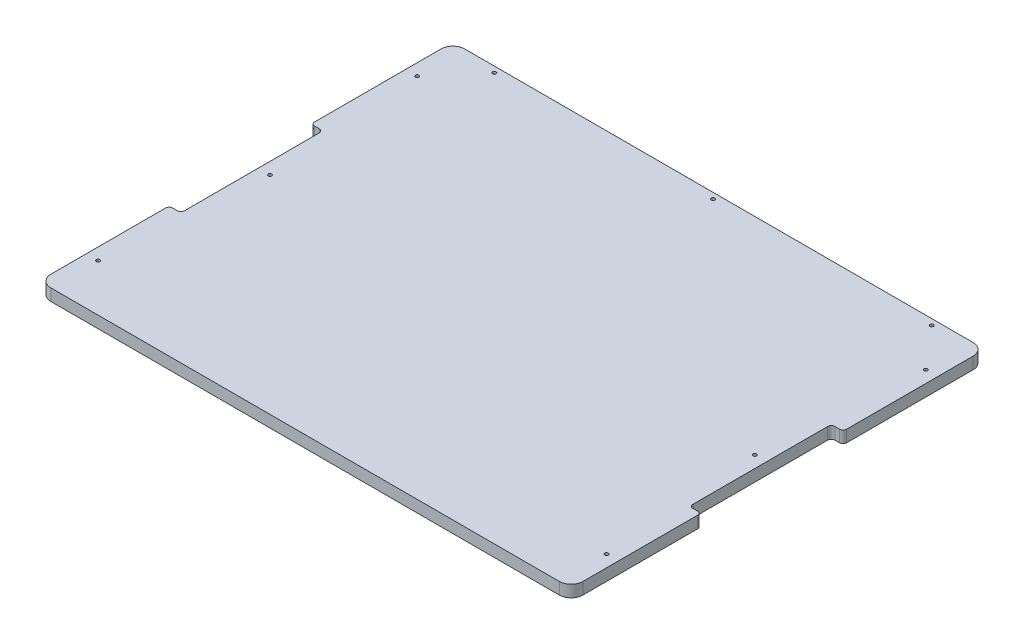
ISO-10303-21;
HEADER;
FILE_DESCRIPTION(('STEP AP214'),'2;1');
FILE_NAME('part.step','',(''),(''),'','','');
FILE_SCHEMA(('AUTOMOTIVE_DESIGN { 1 0 10303 214 1 1 1 1 }'));
ENDSEC;
DATA;
#1=APPLICATION_CONTEXT('core data for automotive mechanical design processes');
#2=APPLICATION_PROTOCOL_DEFINITION('international standard','automotive_design',2000,#1);
#3=PRODUCT_CONTEXT('',#1,'mechanical');
#4=PRODUCT('Part','Part','',(#3));
#5=PRODUCT_RELATED_PRODUCT_CATEGORY('part','',(#4));
#6=PRODUCT_DEFINITION_FORMATION('','',#4);
#7=PRODUCT_DEFINITION_CONTEXT('part definition',#1,'design');
#8=PRODUCT_DEFINITION('design','',#6,#7);
#9=PRODUCT_DEFINITION_SHAPE('','',#8);
#10=(LENGTH_UNIT() NAMED_UNIT(*) SI_UNIT(.MILLI.,.METRE.));
#11=(NAMED_UNIT(*) PLANE_ANGLE_UNIT() SI_UNIT($,.RADIAN.));
#12=(NAMED_UNIT(*) SI_UNIT($,.STERADIAN.) SOLID_ANGLE_UNIT());
#13=UNCERTAINTY_MEASURE_WITH_UNIT(LENGTH_MEASURE(1.E-05),#10,'distance_accuracy_value','');
#14=(GEOMETRIC_REPRESENTATION_CONTEXT(3) GLOBAL_UNCERTAINTY_ASSIGNED_CONTEXT((#13)) GLOBAL_UNIT_ASSIGNED_CONTEXT((#10,
#11,#12)) REPRESENTATION_CONTEXT('',''));
#15=CARTESIAN_POINT('',(0.,0.,0.));
#16=DIRECTION('',(0.,0.,1.));
#17=DIRECTION('',(1.,0.,0.));
#18=AXIS2_PLACEMENT_3D('',#15,#16,#17);
#19=CARTESIAN_POINT('',(-225.,10.,175.));
#20=DIRECTION('',(1.,0.,0.));
#21=DIRECTION('',(0.,0.,-1.));
#22=AXIS2_PLACEMENT_3D('',#19,#20,#21);
#23=PLANE('',#22);
#24=DIRECTION('',(0.,0.,1.));
#25=VECTOR('',#24,1.);
#26=CARTESIAN_POINT('',(-225.,10.,175.));
#27=LINE('',#26,#25);
#28=CARTESIAN_POINT('',(-225.,10.,-165.));
#29=VERTEX_POINT('',#28);
#30=CARTESIAN_POINT('',(-225.,10.,-58.));
#31=VERTEX_POINT('',#30);
#32=EDGE_CURVE('E248',#29,#31,#27,.T.);
#33=ORIENTED_EDGE('',*,*,#32,.F.);
#34=DIRECTION('',(0.,-1.,0.));
#35=VECTOR('',#34,1.);
#36=CARTESIAN_POINT('',(-225.,10.,-165.));
#37=LINE('',#36,#35);
#38=CARTESIAN_POINT('',(-225.,0.,-165.));
#39=VERTEX_POINT('',#38);
#40=EDGE_CURVE('E336',#29,#39,#37,.T.);
#41=ORIENTED_EDGE('',*,*,#40,.T.);
#42=DIRECTION('',(0.,0.,1.));
#43=VECTOR('',#42,1.);
#44=CARTESIAN_POINT('',(-225.,0.,175.));
#45=LINE('',#44,#43);
#46=CARTESIAN_POINT('',(-225.,0.,-58.));
#47=VERTEX_POINT('',#46);
#48=EDGE_CURVE('E257',#39,#47,#45,.T.);
#49=ORIENTED_EDGE('',*,*,#48,.T.);
#50=DIRECTION('',(0.,1.,0.));
#51=VECTOR('',#50,1.);
#52=CARTESIAN_POINT('',(-225.,10.,-58.));
#53=LINE('',#52,#51);
#54=EDGE_CURVE('E331',#47,#31,#53,.T.);
#55=ORIENTED_EDGE('',*,*,#54,.T.);
#56=EDGE_LOOP('',(#33,#41,#49,#55));
#57=FACE_BOUND('',#56,.T.);
#58=ADVANCED_FACE('F33',(#57),#23,.F.);
#59=CARTESIAN_POINT('',(225.,10.,175.));
#60=DIRECTION('',(-1.,0.,0.));
#61=DIRECTION('',(0.,0.,1.));
#62=AXIS2_PLACEMENT_3D('',#59,#60,#61);
#63=PLANE('',#62);
#64=DIRECTION('',(0.,0.,-1.));
#65=VECTOR('',#64,1.);
#66=CARTESIAN_POINT('',(225.,10.,175.));
#67=LINE('',#66,#65);
#68=CARTESIAN_POINT('',(225.,10.,165.));
#69=VERTEX_POINT('',#68);
#70=CARTESIAN_POINT('',(225.,10.,68.));
#71=VERTEX_POINT('',#70);
#72=EDGE_CURVE('E254',#69,#71,#67,.T.);
#73=ORIENTED_EDGE('',*,*,#72,.F.);
#74=DIRECTION('',(0.,-1.,0.));
#75=VECTOR('',#74,1.);
#76=CARTESIAN_POINT('',(225.,10.,165.));
#77=LINE('',#76,#75);
#78=CARTESIAN_POINT('',(225.,0.,165.));
#79=VERTEX_POINT('',#78);
#80=EDGE_CURVE('E41',#69,#79,#77,.T.);
#81=ORIENTED_EDGE('',*,*,#80,.T.);
#82=DIRECTION('',(0.,0.,-1.));
#83=VECTOR('',#82,1.);
#84=CARTESIAN_POINT('',(225.,0.,175.));
#85=LINE('',#84,#83);
#86=CARTESIAN_POINT('',(225.,0.,68.));
#87=VERTEX_POINT('',#86);
#88=EDGE_CURVE('E263',#79,#87,#85,.T.);
#89=ORIENTED_EDGE('',*,*,#88,.T.);
#90=DIRECTION('',(0.,1.,0.));
#91=VECTOR('',#90,1.);
#92=CARTESIAN_POINT('',(225.,10.,68.));
#93=LINE('',#92,#91);
#94=EDGE_CURVE('E299',#87,#71,#93,.T.);
#95=ORIENTED_EDGE('',*,*,#94,.T.);
#96=EDGE_LOOP('',(#73,#81,#89,#95));
#97=FACE_BOUND('',#96,.T.);
#98=ADVANCED_FACE('F369',(#97),#63,.F.);
#99=CARTESIAN_POINT('',(-225.,0.,68.));
#100=VERTEX_POINT('',#99);
#101=CARTESIAN_POINT('',(-225.,0.,165.));
#102=VERTEX_POINT('',#101);
#103=EDGE_CURVE('E260',#100,#102,#45,.T.);
#104=ORIENTED_EDGE('',*,*,#103,.T.);
#105=DIRECTION('',(0.,-1.,0.));
#106=VECTOR('',#105,1.);
#107=CARTESIAN_POINT('',(-225.,10.,165.));
#108=LINE('',#107,#106);
#109=CARTESIAN_POINT('',(-225.,10.,165.));
#110=VERTEX_POINT('',#109);
#111=EDGE_CURVE('E363',#102,#110,#108,.F.);
#112=ORIENTED_EDGE('',*,*,#111,.T.);
#113=CARTESIAN_POINT('',(-225.,10.,68.));
#114=VERTEX_POINT('',#113);
#115=EDGE_CURVE('E251',#114,#110,#27,.T.);
#116=ORIENTED_EDGE('',*,*,#115,.F.);
#117=DIRECTION('',(0.,1.,0.));
#118=VECTOR('',#117,1.);
#119=CARTESIAN_POINT('',(-225.,10.,68.));
#120=LINE('',#119,#118);
#121=EDGE_CURVE('E329',#114,#100,#120,.F.);
#122=ORIENTED_EDGE('',*,*,#121,.T.);
#123=EDGE_LOOP('',(#104,#112,#116,#122));
#124=FACE_BOUND('',#123,.T.);
#125=ADVANCED_FACE('F447',(#124),#23,.F.);
#126=CARTESIAN_POINT('',(-225.,10.,175.));
#127=DIRECTION('',(0.,0.,-1.));
#128=DIRECTION('',(-1.,0.,0.));
#129=AXIS2_PLACEMENT_3D('',#126,#127,#128);
#130=PLANE('',#129);
#131=DIRECTION('',(1.,0.,0.));
#132=VECTOR('',#131,1.);
#133=CARTESIAN_POINT('',(-225.,10.,175.));
#134=LINE('',#133,#132);
#135=CARTESIAN_POINT('',(-215.,10.,175.));
#136=VERTEX_POINT('',#135);
#137=CARTESIAN_POINT('',(215.,10.,175.));
#138=VERTEX_POINT('',#137);
#139=EDGE_CURVE('E250',#136,#138,#134,.T.);
#140=ORIENTED_EDGE('',*,*,#139,.F.);
#141=DIRECTION('',(0.,-1.,0.));
#142=VECTOR('',#141,1.);
#143=CARTESIAN_POINT('',(-215.,10.,175.));
#144=LINE('',#143,#142);
#145=CARTESIAN_POINT('',(-215.,0.,175.));
#146=VERTEX_POINT('',#145);
#147=EDGE_CURVE('E360',#136,#146,#144,.T.);
#148=ORIENTED_EDGE('',*,*,#147,.T.);
#149=DIRECTION('',(1.,0.,0.));
#150=VECTOR('',#149,1.);
#151=CARTESIAN_POINT('',(-225.,0.,175.));
#152=LINE('',#151,#150);
#153=CARTESIAN_POINT('',(215.,0.,175.));
#154=VERTEX_POINT('',#153);
#155=EDGE_CURVE('E259',#146,#154,#152,.T.);
#156=ORIENTED_EDGE('',*,*,#155,.T.);
#157=DIRECTION('',(0.,-1.,0.));
#158=VECTOR('',#157,1.);
#159=CARTESIAN_POINT('',(215.,10.,175.));
#160=LINE('',#159,#158);
#161=EDGE_CURVE('E48',#154,#138,#160,.F.);
#162=ORIENTED_EDGE('',*,*,#161,.T.);
#163=EDGE_LOOP('',(#140,#148,#156,#162));
#164=FACE_BOUND('',#163,.T.);
#165=ADVANCED_FACE('F455',(#164),#130,.F.);
#166=CARTESIAN_POINT('',(225.,0.,-57.9999999999999));
#167=VERTEX_POINT('',#166);
#168=CARTESIAN_POINT('',(225.,0.,-165.));
#169=VERTEX_POINT('',#168);
#170=EDGE_CURVE('E262',#167,#169,#85,.T.);
#171=ORIENTED_EDGE('',*,*,#170,.T.);
#172=DIRECTION('',(0.,-1.,0.));
#173=VECTOR('',#172,1.);
#174=CARTESIAN_POINT('',(225.,10.,-165.));
#175=LINE('',#174,#173);
#176=CARTESIAN_POINT('',(225.,10.,-165.));
#177=VERTEX_POINT('',#176);
#178=EDGE_CURVE('E11',#169,#177,#175,.F.);
#179=ORIENTED_EDGE('',*,*,#178,.T.);
#180=CARTESIAN_POINT('',(225.,10.,-57.9999999999999));
#181=VERTEX_POINT('',#180);
#182=EDGE_CURVE('E253',#181,#177,#67,.T.);
#183=ORIENTED_EDGE('',*,*,#182,.F.);
#184=DIRECTION('',(0.,1.,0.));
#185=VECTOR('',#184,1.);
#186=CARTESIAN_POINT('',(225.,10.,-57.9999999999999));
#187=LINE('',#186,#185);
#188=EDGE_CURVE('E324',#181,#167,#187,.F.);
#189=ORIENTED_EDGE('',*,*,#188,.T.);
#190=EDGE_LOOP('',(#171,#179,#183,#189));
#191=FACE_BOUND('',#190,.T.);
#192=ADVANCED_FACE('F414',(#191),#63,.F.);
#193=CARTESIAN_POINT('',(-225.,10.,-175.));
#194=DIRECTION('',(0.,0.,1.));
#195=DIRECTION('',(1.,0.,0.));
#196=AXIS2_PLACEMENT_3D('',#193,#194,#195);
#197=PLANE('',#196);
#198=DIRECTION('',(-1.,0.,0.));
#199=VECTOR('',#198,1.);
#200=CARTESIAN_POINT('',(-225.,0.,-175.));
#201=LINE('',#200,#199);
#202=CARTESIAN_POINT('',(215.,0.,-175.));
#203=VERTEX_POINT('',#202);
#204=CARTESIAN_POINT('',(-215.,0.,-175.));
#205=VERTEX_POINT('',#204);
#206=EDGE_CURVE('E265',#203,#205,#201,.T.);
#207=ORIENTED_EDGE('',*,*,#206,.T.);
#208=DIRECTION('',(0.,-1.,0.));
#209=VECTOR('',#208,1.);
#210=CARTESIAN_POINT('',(-215.,10.,-175.));
#211=LINE('',#210,#209);
#212=CARTESIAN_POINT('',(-215.,10.,-175.));
#213=VERTEX_POINT('',#212);
#214=EDGE_CURVE('E350',#205,#213,#211,.F.);
#215=ORIENTED_EDGE('',*,*,#214,.T.);
#216=DIRECTION('',(-1.,0.,0.));
#217=VECTOR('',#216,1.);
#218=CARTESIAN_POINT('',(-225.,10.,-175.));
#219=LINE('',#218,#217);
#220=CARTESIAN_POINT('',(215.,10.,-175.));
#221=VERTEX_POINT('',#220);
#222=EDGE_CURVE('E216',#221,#213,#219,.T.);
#223=ORIENTED_EDGE('',*,*,#222,.F.);
#224=DIRECTION('',(0.,-1.,0.));
#225=VECTOR('',#224,1.);
#226=CARTESIAN_POINT('',(215.,10.,-175.));
#227=LINE('',#226,#225);
#228=EDGE_CURVE('E347',#221,#203,#227,.T.);
#229=ORIENTED_EDGE('',*,*,#228,.T.);
#230=EDGE_LOOP('',(#207,#215,#223,#229));
#231=FACE_BOUND('',#230,.T.);
#232=ADVANCED_FACE('F422',(#231),#197,.F.);
#233=CARTESIAN_POINT('',(0.,10.,0.));
#234=DIRECTION('',(0.,-1.,0.));
#235=DIRECTION('',(0.,0.,-1.));
#236=AXIS2_PLACEMENT_3D('',#233,#234,#235);
#237=PLANE('',#236);
#238=CARTESIAN_POINT('',(-215.14083172644,10.,-135.));
#239=DIRECTION('',(0.,1.,0.));
#240=DIRECTION('',(0.,0.,1.));
#241=AXIS2_PLACEMENT_3D('',#238,#239,#240);
#242=CIRCLE('',#241,1.5);
#243=CARTESIAN_POINT('',(-215.14083172644,10.,-133.5));
#244=VERTEX_POINT('',#243);
#245=EDGE_CURVE('E704',#244,#244,#242,.T.);
#246=ORIENTED_EDGE('',*,*,#245,.F.);
#247=EDGE_LOOP('',(#246));
#248=FACE_BOUND('',#247,.T.);
#249=CARTESIAN_POINT('',(-205.,10.,-0.381414611889341));
#250=DIRECTION('',(0.,1.,0.));
#251=DIRECTION('',(0.,0.,1.));
#252=AXIS2_PLACEMENT_3D('',#249,#250,#251);
#253=CIRCLE('',#252,1.5);
#254=CARTESIAN_POINT('',(-205.,10.,1.11858538811066));
#255=VERTEX_POINT('',#254);
#256=EDGE_CURVE('E700',#255,#255,#253,.T.);
#257=ORIENTED_EDGE('',*,*,#256,.F.);
#258=EDGE_LOOP('',(#257));
#259=FACE_BOUND('',#258,.T.);
#260=CARTESIAN_POINT('',(-215.,10.,135.));
#261=DIRECTION('',(0.,1.,0.));
#262=DIRECTION('',(0.,0.,1.));
#263=AXIS2_PLACEMENT_3D('',#260,#261,#262);
#264=CIRCLE('',#263,1.5);
#265=CARTESIAN_POINT('',(-215.,10.,136.5));
#266=VERTEX_POINT('',#265);
#267=EDGE_CURVE('E696',#266,#266,#264,.T.);
#268=ORIENTED_EDGE('',*,*,#267,.F.);
#269=EDGE_LOOP('',(#268));
#270=FACE_BOUND('',#269,.T.);
#271=CARTESIAN_POINT('',(215.,10.,135.));
#272=DIRECTION('',(0.,1.,0.));
#273=DIRECTION('',(0.,0.,1.));
#274=AXIS2_PLACEMENT_3D('',#271,#272,#273);
#275=CIRCLE('',#274,1.5);
#276=CARTESIAN_POINT('',(215.,10.,136.5));
#277=VERTEX_POINT('',#276);
#278=EDGE_CURVE('E682',#277,#277,#275,.T.);
#279=ORIENTED_EDGE('',*,*,#278,.F.);
#280=EDGE_LOOP('',(#279));
#281=FACE_BOUND('',#280,.T.);
#282=CARTESIAN_POINT('',(205.,10.,-0.37087982163736));
#283=DIRECTION('',(0.,1.,0.));
#284=DIRECTION('',(0.,0.,1.));
#285=AXIS2_PLACEMENT_3D('',#282,#283,#284);
#286=CIRCLE('',#285,1.5);
#287=CARTESIAN_POINT('',(205.,10.,1.12912017836264));
#288=VERTEX_POINT('',#287);
#289=EDGE_CURVE('E720',#288,#288,#286,.T.);
#290=ORIENTED_EDGE('',*,*,#289,.F.);
#291=EDGE_LOOP('',(#290));
#292=FACE_BOUND('',#291,.T.);
#293=CARTESIAN_POINT('',(215.,10.,-135.));
#294=DIRECTION('',(0.,1.,0.));
#295=DIRECTION('',(0.,0.,1.));
#296=AXIS2_PLACEMENT_3D('',#293,#294,#295);
#297=CIRCLE('',#296,1.5);
#298=CARTESIAN_POINT('',(215.,10.,-133.5));
#299=VERTEX_POINT('',#298);
#300=EDGE_CURVE('E716',#299,#299,#297,.T.);
#301=ORIENTED_EDGE('',*,*,#300,.F.);
#302=EDGE_LOOP('',(#301));
#303=FACE_BOUND('',#302,.T.);
#304=CARTESIAN_POINT('',(0.,10.,-170.));
#305=DIRECTION('',(0.,1.,0.));
#306=DIRECTION('',(0.,0.,1.));
#307=AXIS2_PLACEMENT_3D('',#304,#305,#306);
#308=CIRCLE('',#307,1.5);
#309=CARTESIAN_POINT('',(0.,10.,-168.5));
#310=VERTEX_POINT('',#309);
#311=EDGE_CURVE('E712',#310,#310,#308,.T.);
#312=ORIENTED_EDGE('',*,*,#311,.F.);
#313=EDGE_LOOP('',(#312));
#314=FACE_BOUND('',#313,.T.);
#315=CARTESIAN_POINT('',(185.,10.,-170.));
#316=DIRECTION('',(0.,1.,0.));
#317=DIRECTION('',(0.,0.,1.));
#318=AXIS2_PLACEMENT_3D('',#315,#316,#317);
#319=CIRCLE('',#318,1.5);
#320=CARTESIAN_POINT('',(185.,10.,-168.5));
#321=VERTEX_POINT('',#320);
#322=EDGE_CURVE('E708',#321,#321,#319,.T.);
#323=ORIENTED_EDGE('',*,*,#322,.F.);
#324=EDGE_LOOP('',(#323));
#325=FACE_BOUND('',#324,.T.);
#326=CARTESIAN_POINT('',(-185.,10.,-170.));
#327=DIRECTION('',(0.,1.,0.));
#328=DIRECTION('',(0.,0.,1.));
#329=AXIS2_PLACEMENT_3D('',#326,#327,#328);
#330=CIRCLE('',#329,1.5);
#331=CARTESIAN_POINT('',(-185.,10.,-168.5));
#332=VERTEX_POINT('',#331);
#333=EDGE_CURVE('E677',#332,#332,#330,.T.);
#334=ORIENTED_EDGE('',*,*,#333,.F.);
#335=EDGE_LOOP('',(#334));
#336=FACE_BOUND('',#335,.T.);
#337=ORIENTED_EDGE('',*,*,#222,.T.);
#338=CARTESIAN_POINT('',(-215.,10.,-165.));
#339=DIRECTION('',(0.,-1.,0.));
#340=DIRECTION('',(0.,0.,-1.));
#341=AXIS2_PLACEMENT_3D('',#338,#339,#340);
#342=CIRCLE('',#341,10.);
#343=EDGE_CURVE('E357',#213,#29,#342,.F.);
#344=ORIENTED_EDGE('',*,*,#343,.T.);
#345=ORIENTED_EDGE('',*,*,#32,.T.);
#346=CARTESIAN_POINT('',(-222.,10.,-58.));
#347=DIRECTION('',(0.,-1.,0.));
#348=DIRECTION('',(0.,0.,-1.));
#349=AXIS2_PLACEMENT_3D('',#346,#347,#348);
#350=CIRCLE('',#349,3.);
#351=CARTESIAN_POINT('',(-222.,10.,-55.));
#352=VERTEX_POINT('',#351);
#353=EDGE_CURVE('E221',#31,#352,#350,.F.);
#354=ORIENTED_EDGE('',*,*,#353,.T.);
#355=DIRECTION('',(-1.,0.,0.));
#356=VECTOR('',#355,1.);
#357=CARTESIAN_POINT('',(-225.,10.,-55.));
#358=LINE('',#357,#356);
#359=CARTESIAN_POINT('',(-218.,10.,-55.));
#360=VERTEX_POINT('',#359);
#361=EDGE_CURVE('E211',#360,#352,#358,.T.);
#362=ORIENTED_EDGE('',*,*,#361,.F.);
#363=CARTESIAN_POINT('',(-218.,10.,-52.));
#364=DIRECTION('',(0.,-1.,0.));
#365=DIRECTION('',(0.,0.,-1.));
#366=AXIS2_PLACEMENT_3D('',#363,#364,#365);
#367=CIRCLE('',#366,3.);
#368=CARTESIAN_POINT('',(-215.,10.,-52.));
#369=VERTEX_POINT('',#368);
#370=EDGE_CURVE('E195',#360,#369,#367,.T.);
#371=ORIENTED_EDGE('',*,*,#370,.T.);
#372=DIRECTION('',(0.,0.,-1.));
#373=VECTOR('',#372,1.);
#374=CARTESIAN_POINT('',(-215.,10.,-55.));
#375=LINE('',#374,#373);
#376=CARTESIAN_POINT('',(-215.,10.,62.));
#377=VERTEX_POINT('',#376);
#378=EDGE_CURVE('E223',#377,#369,#375,.T.);
#379=ORIENTED_EDGE('',*,*,#378,.F.);
#380=CARTESIAN_POINT('',(-218.,10.,62.));
#381=DIRECTION('',(0.,-1.,0.));
#382=DIRECTION('',(0.,0.,-1.));
#383=AXIS2_PLACEMENT_3D('',#380,#381,#382);
#384=CIRCLE('',#383,3.);
#385=CARTESIAN_POINT('',(-218.,10.,65.));
#386=VERTEX_POINT('',#385);
#387=EDGE_CURVE('E285',#377,#386,#384,.T.);
#388=ORIENTED_EDGE('',*,*,#387,.T.);
#389=DIRECTION('',(1.,0.,0.));
#390=VECTOR('',#389,1.);
#391=CARTESIAN_POINT('',(-225.,10.,65.));
#392=LINE('',#391,#390);
#393=CARTESIAN_POINT('',(-222.,10.,65.));
#394=VERTEX_POINT('',#393);
#395=EDGE_CURVE('E227',#394,#386,#392,.T.);
#396=ORIENTED_EDGE('',*,*,#395,.F.);
#397=CARTESIAN_POINT('',(-222.,10.,68.));
#398=DIRECTION('',(0.,-1.,0.));
#399=DIRECTION('',(0.,0.,-1.));
#400=AXIS2_PLACEMENT_3D('',#397,#398,#399);
#401=CIRCLE('',#400,3.);
#402=EDGE_CURVE('E303',#394,#114,#401,.F.);
#403=ORIENTED_EDGE('',*,*,#402,.T.);
#404=ORIENTED_EDGE('',*,*,#115,.T.);
#405=CARTESIAN_POINT('',(-215.,10.,165.));
#406=DIRECTION('',(0.,-1.,0.));
#407=DIRECTION('',(0.,0.,-1.));
#408=AXIS2_PLACEMENT_3D('',#405,#406,#407);
#409=CIRCLE('',#408,10.);
#410=EDGE_CURVE('E55',#110,#136,#409,.F.);
#411=ORIENTED_EDGE('',*,*,#410,.T.);
#412=ORIENTED_EDGE('',*,*,#139,.T.);
#413=CARTESIAN_POINT('',(215.,10.,165.));
#414=DIRECTION('',(0.,-1.,0.));
#415=DIRECTION('',(0.,0.,-1.));
#416=AXIS2_PLACEMENT_3D('',#413,#414,#415);
#417=CIRCLE('',#416,10.);
#418=EDGE_CURVE('E354',#138,#69,#417,.F.);
#419=ORIENTED_EDGE('',*,*,#418,.T.);
#420=ORIENTED_EDGE('',*,*,#72,.T.);
#421=CARTESIAN_POINT('',(222.,10.,68.));
#422=DIRECTION('',(0.,-1.,0.));
#423=DIRECTION('',(0.,0.,-1.));
#424=AXIS2_PLACEMENT_3D('',#421,#422,#423);
#425=CIRCLE('',#424,3.);
#426=CARTESIAN_POINT('',(222.,10.,65.));
#427=VERTEX_POINT('',#426);
#428=EDGE_CURVE('E307',#71,#427,#425,.F.);
#429=ORIENTED_EDGE('',*,*,#428,.T.);
#430=DIRECTION('',(1.,0.,0.));
#431=VECTOR('',#430,1.);
#432=CARTESIAN_POINT('',(225.,10.,65.));
#433=LINE('',#432,#431);
#434=CARTESIAN_POINT('',(218.,10.,65.));
#435=VERTEX_POINT('',#434);
#436=EDGE_CURVE('E234',#435,#427,#433,.T.);
#437=ORIENTED_EDGE('',*,*,#436,.F.);
#438=CARTESIAN_POINT('',(218.,10.,62.));
#439=DIRECTION('',(0.,-1.,0.));
#440=DIRECTION('',(0.,0.,-1.));
#441=AXIS2_PLACEMENT_3D('',#438,#439,#440);
#442=CIRCLE('',#441,3.);
#443=CARTESIAN_POINT('',(215.,10.,62.));
#444=VERTEX_POINT('',#443);
#445=EDGE_CURVE('E290',#435,#444,#442,.T.);
#446=ORIENTED_EDGE('',*,*,#445,.T.);
#447=DIRECTION('',(0.,0.,1.));
#448=VECTOR('',#447,1.);
#449=CARTESIAN_POINT('',(215.,10.,65.));
#450=LINE('',#449,#448);
#451=CARTESIAN_POINT('',(215.,10.,-51.9999999999999));
#452=VERTEX_POINT('',#451);
#453=EDGE_CURVE('E242',#452,#444,#450,.T.);
#454=ORIENTED_EDGE('',*,*,#453,.F.);
#455=CARTESIAN_POINT('',(218.,10.,-51.9999999999999));
#456=DIRECTION('',(0.,-1.,0.));
#457=DIRECTION('',(0.,0.,-1.));
#458=AXIS2_PLACEMENT_3D('',#455,#456,#457);
#459=CIRCLE('',#458,3.);
#460=CARTESIAN_POINT('',(218.,10.,-54.9999999999999));
#461=VERTEX_POINT('',#460);
#462=EDGE_CURVE('E294',#452,#461,#459,.T.);
#463=ORIENTED_EDGE('',*,*,#462,.T.);
#464=DIRECTION('',(-1.,0.,0.));
#465=VECTOR('',#464,1.);
#466=CARTESIAN_POINT('',(225.,10.,-54.9999999999999));
#467=LINE('',#466,#465);
#468=CARTESIAN_POINT('',(222.,10.,-54.9999999999999));
#469=VERTEX_POINT('',#468);
#470=EDGE_CURVE('E240',#469,#461,#467,.T.);
#471=ORIENTED_EDGE('',*,*,#470,.F.);
#472=CARTESIAN_POINT('',(222.,10.,-57.9999999999999));
#473=DIRECTION('',(0.,-1.,0.));
#474=DIRECTION('',(0.,0.,-1.));
#475=AXIS2_PLACEMENT_3D('',#472,#473,#474);
#476=CIRCLE('',#475,3.);
#477=EDGE_CURVE('E305',#469,#181,#476,.F.);
#478=ORIENTED_EDGE('',*,*,#477,.T.);
#479=ORIENTED_EDGE('',*,*,#182,.T.);
#480=CARTESIAN_POINT('',(215.,10.,-165.));
#481=DIRECTION('',(0.,-1.,0.));
#482=DIRECTION('',(0.,0.,-1.));
#483=AXIS2_PLACEMENT_3D('',#480,#481,#482);
#484=CIRCLE('',#483,10.);
#485=EDGE_CURVE('E352',#177,#221,#484,.F.);
#486=ORIENTED_EDGE('',*,*,#485,.T.);
#487=EDGE_LOOP('',(#337,#344,#345,#354,#362,#371,#379,#388,#396,#403,#404,#411,#412,#419,#420,
#429,#437,#446,#454,#463,#471,#478,#479,#486));
#488=FACE_BOUND('',#487,.T.);
#489=ADVANCED_FACE('F219',(#248,#259,#270,#281,#292,#303,#314,#325,#336,#488),#237,.F.);
#490=CARTESIAN_POINT('',(0.,0.,0.));
#491=DIRECTION('',(0.,-1.,0.));
#492=DIRECTION('',(0.,0.,-1.));
#493=AXIS2_PLACEMENT_3D('',#490,#491,#492);
#494=PLANE('',#493);
#495=CARTESIAN_POINT('',(-215.14083172644,0.,-135.));
#496=DIRECTION('',(0.,1.,0.));
#497=DIRECTION('',(0.,0.,1.));
#498=AXIS2_PLACEMENT_3D('',#495,#496,#497);
#499=CIRCLE('',#498,1.5);
#500=CARTESIAN_POINT('',(-215.14083172644,0.,-133.5));
#501=VERTEX_POINT('',#500);
#502=EDGE_CURVE('E645',#501,#501,#499,.T.);
#503=ORIENTED_EDGE('',*,*,#502,.T.);
#504=EDGE_LOOP('',(#503));
#505=FACE_BOUND('',#504,.T.);
#506=CARTESIAN_POINT('',(-205.,0.,-0.381414611889341));
#507=DIRECTION('',(0.,1.,0.));
#508=DIRECTION('',(0.,0.,1.));
#509=AXIS2_PLACEMENT_3D('',#506,#507,#508);
#510=CIRCLE('',#509,1.5);
#511=CARTESIAN_POINT('',(-205.,0.,1.11858538811066));
#512=VERTEX_POINT('',#511);
#513=EDGE_CURVE('E649',#512,#512,#510,.T.);
#514=ORIENTED_EDGE('',*,*,#513,.T.);
#515=EDGE_LOOP('',(#514));
#516=FACE_BOUND('',#515,.T.);
#517=CARTESIAN_POINT('',(-215.,0.,135.));
#518=DIRECTION('',(0.,1.,0.));
#519=DIRECTION('',(0.,0.,1.));
#520=AXIS2_PLACEMENT_3D('',#517,#518,#519);
#521=CIRCLE('',#520,1.5);
#522=CARTESIAN_POINT('',(-215.,0.,136.5));
#523=VERTEX_POINT('',#522);
#524=EDGE_CURVE('E653',#523,#523,#521,.T.);
#525=ORIENTED_EDGE('',*,*,#524,.T.);
#526=EDGE_LOOP('',(#525));
#527=FACE_BOUND('',#526,.T.);
#528=CARTESIAN_POINT('',(215.,0.,135.));
#529=DIRECTION('',(0.,1.,0.));
#530=DIRECTION('',(0.,0.,1.));
#531=AXIS2_PLACEMENT_3D('',#528,#529,#530);
#532=CIRCLE('',#531,1.5);
#533=CARTESIAN_POINT('',(215.,0.,136.5));
#534=VERTEX_POINT('',#533);
#535=EDGE_CURVE('E657',#534,#534,#532,.T.);
#536=ORIENTED_EDGE('',*,*,#535,.T.);
#537=EDGE_LOOP('',(#536));
#538=FACE_BOUND('',#537,.T.);
#539=CARTESIAN_POINT('',(205.,0.,-0.37087982163736));
#540=DIRECTION('',(0.,1.,0.));
#541=DIRECTION('',(0.,0.,1.));
#542=AXIS2_PLACEMENT_3D('',#539,#540,#541);
#543=CIRCLE('',#542,1.5);
#544=CARTESIAN_POINT('',(205.,0.,1.12912017836264));
#545=VERTEX_POINT('',#544);
#546=EDGE_CURVE('E661',#545,#545,#543,.T.);
#547=ORIENTED_EDGE('',*,*,#546,.T.);
#548=EDGE_LOOP('',(#547));
#549=FACE_BOUND('',#548,.T.);
#550=CARTESIAN_POINT('',(215.,0.,-135.));
#551=DIRECTION('',(0.,1.,0.));
#552=DIRECTION('',(0.,0.,1.));
#553=AXIS2_PLACEMENT_3D('',#550,#551,#552);
#554=CIRCLE('',#553,1.5);
#555=CARTESIAN_POINT('',(215.,0.,-133.5));
#556=VERTEX_POINT('',#555);
#557=EDGE_CURVE('E665',#556,#556,#554,.T.);
#558=ORIENTED_EDGE('',*,*,#557,.T.);
#559=EDGE_LOOP('',(#558));
#560=FACE_BOUND('',#559,.T.);
#561=CARTESIAN_POINT('',(0.,0.,-170.));
#562=DIRECTION('',(0.,1.,0.));
#563=DIRECTION('',(0.,0.,1.));
#564=AXIS2_PLACEMENT_3D('',#561,#562,#563);
#565=CIRCLE('',#564,1.5);
#566=CARTESIAN_POINT('',(0.,0.,-168.5));
#567=VERTEX_POINT('',#566);
#568=EDGE_CURVE('E669',#567,#567,#565,.T.);
#569=ORIENTED_EDGE('',*,*,#568,.T.);
#570=EDGE_LOOP('',(#569));
#571=FACE_BOUND('',#570,.T.);
#572=CARTESIAN_POINT('',(185.,0.,-170.));
#573=DIRECTION('',(0.,1.,0.));
#574=DIRECTION('',(0.,0.,1.));
#575=AXIS2_PLACEMENT_3D('',#572,#573,#574);
#576=CIRCLE('',#575,1.5);
#577=CARTESIAN_POINT('',(185.,0.,-168.5));
#578=VERTEX_POINT('',#577);
#579=EDGE_CURVE('E673',#578,#578,#576,.T.);
#580=ORIENTED_EDGE('',*,*,#579,.T.);
#581=EDGE_LOOP('',(#580));
#582=FACE_BOUND('',#581,.T.);
#583=CARTESIAN_POINT('',(-185.,0.,-170.));
#584=DIRECTION('',(0.,1.,0.));
#585=DIRECTION('',(0.,0.,1.));
#586=AXIS2_PLACEMENT_3D('',#583,#584,#585);
#587=CIRCLE('',#586,1.5);
#588=CARTESIAN_POINT('',(-185.,0.,-168.5));
#589=VERTEX_POINT('',#588);
#590=EDGE_CURVE('E243',#589,#589,#587,.T.);
#591=ORIENTED_EDGE('',*,*,#590,.T.);
#592=EDGE_LOOP('',(#591));
#593=FACE_BOUND('',#592,.T.);
#594=ORIENTED_EDGE('',*,*,#48,.F.);
#595=CARTESIAN_POINT('',(-215.,0.,-165.));
#596=DIRECTION('',(0.,-1.,0.));
#597=DIRECTION('',(0.,0.,-1.));
#598=AXIS2_PLACEMENT_3D('',#595,#596,#597);
#599=CIRCLE('',#598,10.);
#600=EDGE_CURVE('E345',#39,#205,#599,.T.);
#601=ORIENTED_EDGE('',*,*,#600,.T.);
#602=ORIENTED_EDGE('',*,*,#206,.F.);
#603=CARTESIAN_POINT('',(215.,0.,-165.));
#604=DIRECTION('',(0.,-1.,0.));
#605=DIRECTION('',(0.,0.,-1.));
#606=AXIS2_PLACEMENT_3D('',#603,#604,#605);
#607=CIRCLE('',#606,10.);
#608=EDGE_CURVE('E339',#203,#169,#607,.T.);
#609=ORIENTED_EDGE('',*,*,#608,.T.);
#610=ORIENTED_EDGE('',*,*,#170,.F.);
#611=CARTESIAN_POINT('',(222.,0.,-57.9999999999999));
#612=DIRECTION('',(0.,-1.,0.));
#613=DIRECTION('',(0.,0.,-1.));
#614=AXIS2_PLACEMENT_3D('',#611,#612,#613);
#615=CIRCLE('',#614,3.);
#616=CARTESIAN_POINT('',(222.,0.,-54.9999999999999));
#617=VERTEX_POINT('',#616);
#618=EDGE_CURVE('E316',#167,#617,#615,.T.);
#619=ORIENTED_EDGE('',*,*,#618,.T.);
#620=DIRECTION('',(-1.,0.,0.));
#621=VECTOR('',#620,1.);
#622=CARTESIAN_POINT('',(225.,0.,-54.9999999999999));
#623=LINE('',#622,#621);
#624=CARTESIAN_POINT('',(218.,0.,-54.9999999999999));
#625=VERTEX_POINT('',#624);
#626=EDGE_CURVE('E231',#617,#625,#623,.T.);
#627=ORIENTED_EDGE('',*,*,#626,.T.);
#628=CARTESIAN_POINT('',(218.,0.,-51.9999999999999));
#629=DIRECTION('',(0.,-1.,0.));
#630=DIRECTION('',(0.,0.,-1.));
#631=AXIS2_PLACEMENT_3D('',#628,#629,#630);
#632=CIRCLE('',#631,3.);
#633=CARTESIAN_POINT('',(215.,0.,-51.9999999999999));
#634=VERTEX_POINT('',#633);
#635=EDGE_CURVE('E297',#625,#634,#632,.F.);
#636=ORIENTED_EDGE('',*,*,#635,.T.);
#637=DIRECTION('',(0.,0.,1.));
#638=VECTOR('',#637,1.);
#639=CARTESIAN_POINT('',(215.,0.,65.));
#640=LINE('',#639,#638);
#641=CARTESIAN_POINT('',(215.,0.,62.));
#642=VERTEX_POINT('',#641);
#643=EDGE_CURVE('E233',#634,#642,#640,.T.);
#644=ORIENTED_EDGE('',*,*,#643,.T.);
#645=CARTESIAN_POINT('',(218.,0.,62.));
#646=DIRECTION('',(0.,-1.,0.));
#647=DIRECTION('',(0.,0.,-1.));
#648=AXIS2_PLACEMENT_3D('',#645,#646,#647);
#649=CIRCLE('',#648,3.);
#650=CARTESIAN_POINT('',(218.,0.,65.));
#651=VERTEX_POINT('',#650);
#652=EDGE_CURVE('E292',#642,#651,#649,.F.);
#653=ORIENTED_EDGE('',*,*,#652,.T.);
#654=DIRECTION('',(1.,0.,0.));
#655=VECTOR('',#654,1.);
#656=CARTESIAN_POINT('',(225.,0.,65.));
#657=LINE('',#656,#655);
#658=CARTESIAN_POINT('',(222.,0.,65.));
#659=VERTEX_POINT('',#658);
#660=EDGE_CURVE('E237',#651,#659,#657,.T.);
#661=ORIENTED_EDGE('',*,*,#660,.T.);
#662=CARTESIAN_POINT('',(222.,0.,68.));
#663=DIRECTION('',(0.,-1.,0.));
#664=DIRECTION('',(0.,0.,-1.));
#665=AXIS2_PLACEMENT_3D('',#662,#663,#664);
#666=CIRCLE('',#665,3.);
#667=EDGE_CURVE('E318',#659,#87,#666,.T.);
#668=ORIENTED_EDGE('',*,*,#667,.T.);
#669=ORIENTED_EDGE('',*,*,#88,.F.);
#670=CARTESIAN_POINT('',(215.,0.,165.));
#671=DIRECTION('',(0.,-1.,0.));
#672=DIRECTION('',(0.,0.,-1.));
#673=AXIS2_PLACEMENT_3D('',#670,#671,#672);
#674=CIRCLE('',#673,10.);
#675=EDGE_CURVE('E341',#79,#154,#674,.T.);
#676=ORIENTED_EDGE('',*,*,#675,.T.);
#677=ORIENTED_EDGE('',*,*,#155,.F.);
#678=CARTESIAN_POINT('',(-215.,0.,165.));
#679=DIRECTION('',(0.,-1.,0.));
#680=DIRECTION('',(0.,0.,-1.));
#681=AXIS2_PLACEMENT_3D('',#678,#679,#680);
#682=CIRCLE('',#681,10.);
#683=EDGE_CURVE('E343',#146,#102,#682,.T.);
#684=ORIENTED_EDGE('',*,*,#683,.T.);
#685=ORIENTED_EDGE('',*,*,#103,.F.);
#686=CARTESIAN_POINT('',(-222.,0.,68.));
#687=DIRECTION('',(0.,-1.,0.));
#688=DIRECTION('',(0.,0.,-1.));
#689=AXIS2_PLACEMENT_3D('',#686,#687,#688);
#690=CIRCLE('',#689,3.);
#691=CARTESIAN_POINT('',(-222.,0.,65.));
#692=VERTEX_POINT('',#691);
#693=EDGE_CURVE('E314',#100,#692,#690,.T.);
#694=ORIENTED_EDGE('',*,*,#693,.T.);
#695=DIRECTION('',(1.,0.,0.));
#696=VECTOR('',#695,1.);
#697=CARTESIAN_POINT('',(-225.,0.,65.));
#698=LINE('',#697,#696);
#699=CARTESIAN_POINT('',(-218.,0.,65.));
#700=VERTEX_POINT('',#699);
#701=EDGE_CURVE('E222',#692,#700,#698,.T.);
#702=ORIENTED_EDGE('',*,*,#701,.T.);
#703=CARTESIAN_POINT('',(-218.,0.,62.));
#704=DIRECTION('',(0.,-1.,0.));
#705=DIRECTION('',(0.,0.,-1.));
#706=AXIS2_PLACEMENT_3D('',#703,#704,#705);
#707=CIRCLE('',#706,3.);
#708=CARTESIAN_POINT('',(-215.,0.,62.));
#709=VERTEX_POINT('',#708);
#710=EDGE_CURVE('E288',#700,#709,#707,.F.);
#711=ORIENTED_EDGE('',*,*,#710,.T.);
#712=DIRECTION('',(0.,0.,-1.));
#713=VECTOR('',#712,1.);
#714=CARTESIAN_POINT('',(-215.,0.,-55.));
#715=LINE('',#714,#713);
#716=CARTESIAN_POINT('',(-215.,0.,-52.));
#717=VERTEX_POINT('',#716);
#718=EDGE_CURVE('E225',#709,#717,#715,.T.);
#719=ORIENTED_EDGE('',*,*,#718,.T.);
#720=CARTESIAN_POINT('',(-218.,0.,-52.));
#721=DIRECTION('',(0.,-1.,0.));
#722=DIRECTION('',(0.,0.,-1.));
#723=AXIS2_PLACEMENT_3D('',#720,#721,#722);
#724=CIRCLE('',#723,3.);
#725=CARTESIAN_POINT('',(-218.,0.,-55.));
#726=VERTEX_POINT('',#725);
#727=EDGE_CURVE('E204',#717,#726,#724,.F.);
#728=ORIENTED_EDGE('',*,*,#727,.T.);
#729=DIRECTION('',(-1.,0.,0.));
#730=VECTOR('',#729,1.);
#731=CARTESIAN_POINT('',(-225.,0.,-55.));
#732=LINE('',#731,#730);
#733=CARTESIAN_POINT('',(-222.,0.,-55.));
#734=VERTEX_POINT('',#733);
#735=EDGE_CURVE('E214',#726,#734,#732,.T.);
#736=ORIENTED_EDGE('',*,*,#735,.T.);
#737=CARTESIAN_POINT('',(-222.,0.,-58.));
#738=DIRECTION('',(0.,-1.,0.));
#739=DIRECTION('',(0.,0.,-1.));
#740=AXIS2_PLACEMENT_3D('',#737,#738,#739);
#741=CIRCLE('',#740,3.);
#742=EDGE_CURVE('E311',#734,#47,#741,.T.);
#743=ORIENTED_EDGE('',*,*,#742,.T.);
#744=EDGE_LOOP('',(#594,#601,#602,#609,#610,#619,#627,#636,#644,#653,#661,#668,#669,#676,#677,
#684,#685,#694,#702,#711,#719,#728,#736,#743));
#745=FACE_BOUND('',#744,.T.);
#746=ADVANCED_FACE('F374',(#505,#516,#527,#538,#549,#560,#571,#582,#593,#745),#494,.T.);
#747=CARTESIAN_POINT('',(225.,0.,65.));
#748=DIRECTION('',(0.,0.,1.));
#749=DIRECTION('',(1.,0.,0.));
#750=AXIS2_PLACEMENT_3D('',#747,#748,#749);
#751=PLANE('',#750);
#752=ORIENTED_EDGE('',*,*,#436,.T.);
#753=DIRECTION('',(0.,1.,0.));
#754=VECTOR('',#753,1.);
#755=CARTESIAN_POINT('',(222.,0.,65.));
#756=LINE('',#755,#754);
#757=EDGE_CURVE('E309',#427,#659,#756,.F.);
#758=ORIENTED_EDGE('',*,*,#757,.T.);
#759=ORIENTED_EDGE('',*,*,#660,.F.);
#760=DIRECTION('',(0.,1.,0.));
#761=VECTOR('',#760,1.);
#762=CARTESIAN_POINT('',(218.,10.,65.));
#763=LINE('',#762,#761);
#764=EDGE_CURVE('E274',#651,#435,#763,.T.);
#765=ORIENTED_EDGE('',*,*,#764,.T.);
#766=EDGE_LOOP('',(#752,#758,#759,#765));
#767=FACE_BOUND('',#766,.T.);
#768=ADVANCED_FACE('F385',(#767),#751,.F.);
#769=CARTESIAN_POINT('',(215.,0.,65.));
#770=DIRECTION('',(-1.,0.,0.));
#771=DIRECTION('',(0.,0.,1.));
#772=AXIS2_PLACEMENT_3D('',#769,#770,#771);
#773=PLANE('',#772);
#774=ORIENTED_EDGE('',*,*,#453,.T.);
#775=DIRECTION('',(0.,1.,0.));
#776=VECTOR('',#775,1.);
#777=CARTESIAN_POINT('',(215.,0.,62.));
#778=LINE('',#777,#776);
#779=EDGE_CURVE('E280',#444,#642,#778,.F.);
#780=ORIENTED_EDGE('',*,*,#779,.T.);
#781=ORIENTED_EDGE('',*,*,#643,.F.);
#782=DIRECTION('',(0.,1.,0.));
#783=VECTOR('',#782,1.);
#784=CARTESIAN_POINT('',(215.,10.,-51.9999999999999));
#785=LINE('',#784,#783);
#786=EDGE_CURVE('E277',#634,#452,#785,.T.);
#787=ORIENTED_EDGE('',*,*,#786,.T.);
#788=EDGE_LOOP('',(#774,#780,#781,#787));
#789=FACE_BOUND('',#788,.T.);
#790=ADVANCED_FACE('F393',(#789),#773,.F.);
#791=CARTESIAN_POINT('',(225.,0.,-54.9999999999999));
#792=DIRECTION('',(0.,0.,-1.));
#793=DIRECTION('',(-1.,0.,0.));
#794=AXIS2_PLACEMENT_3D('',#791,#792,#793);
#795=PLANE('',#794);
#796=ORIENTED_EDGE('',*,*,#626,.F.);
#797=DIRECTION('',(0.,1.,0.));
#798=VECTOR('',#797,1.);
#799=CARTESIAN_POINT('',(222.,0.,-54.9999999999999));
#800=LINE('',#799,#798);
#801=EDGE_CURVE('E321',#617,#469,#800,.T.);
#802=ORIENTED_EDGE('',*,*,#801,.T.);
#803=ORIENTED_EDGE('',*,*,#470,.T.);
#804=DIRECTION('',(0.,1.,0.));
#805=VECTOR('',#804,1.);
#806=CARTESIAN_POINT('',(218.,0.,-54.9999999999999));
#807=LINE('',#806,#805);
#808=EDGE_CURVE('E205',#461,#625,#807,.F.);
#809=ORIENTED_EDGE('',*,*,#808,.T.);
#810=EDGE_LOOP('',(#796,#802,#803,#809));
#811=FACE_BOUND('',#810,.T.);
#812=ADVANCED_FACE('F405',(#811),#795,.F.);
#813=CARTESIAN_POINT('',(-225.,0.,-55.));
#814=DIRECTION('',(0.,0.,-1.));
#815=DIRECTION('',(-1.,0.,0.));
#816=AXIS2_PLACEMENT_3D('',#813,#814,#815);
#817=PLANE('',#816);
#818=ORIENTED_EDGE('',*,*,#361,.T.);
#819=DIRECTION('',(0.,1.,0.));
#820=VECTOR('',#819,1.);
#821=CARTESIAN_POINT('',(-222.,0.,-55.));
#822=LINE('',#821,#820);
#823=EDGE_CURVE('E334',#352,#734,#822,.F.);
#824=ORIENTED_EDGE('',*,*,#823,.T.);
#825=ORIENTED_EDGE('',*,*,#735,.F.);
#826=DIRECTION('',(0.,1.,0.));
#827=VECTOR('',#826,1.);
#828=CARTESIAN_POINT('',(-218.,10.,-55.));
#829=LINE('',#828,#827);
#830=EDGE_CURVE('E199',#726,#360,#829,.T.);
#831=ORIENTED_EDGE('',*,*,#830,.T.);
#832=EDGE_LOOP('',(#818,#824,#825,#831));
#833=FACE_BOUND('',#832,.T.);
#834=ADVANCED_FACE('F210',(#833),#817,.F.);
#835=CARTESIAN_POINT('',(-215.,0.,-55.));
#836=DIRECTION('',(1.,0.,0.));
#837=DIRECTION('',(0.,0.,-1.));
#838=AXIS2_PLACEMENT_3D('',#835,#836,#837);
#839=PLANE('',#838);
#840=ORIENTED_EDGE('',*,*,#378,.T.);
#841=DIRECTION('',(0.,1.,0.));
#842=VECTOR('',#841,1.);
#843=CARTESIAN_POINT('',(-215.,0.,-52.));
#844=LINE('',#843,#842);
#845=EDGE_CURVE('E200',#369,#717,#844,.F.);
#846=ORIENTED_EDGE('',*,*,#845,.T.);
#847=ORIENTED_EDGE('',*,*,#718,.F.);
#848=DIRECTION('',(0.,1.,0.));
#849=VECTOR('',#848,1.);
#850=CARTESIAN_POINT('',(-215.,10.,62.));
#851=LINE('',#850,#849);
#852=EDGE_CURVE('E215',#709,#377,#851,.T.);
#853=ORIENTED_EDGE('',*,*,#852,.T.);
#854=EDGE_LOOP('',(#840,#846,#847,#853));
#855=FACE_BOUND('',#854,.T.);
#856=ADVANCED_FACE('F559',(#855),#839,.F.);
#857=CARTESIAN_POINT('',(-225.,0.,65.));
#858=DIRECTION('',(0.,0.,1.));
#859=DIRECTION('',(1.,0.,0.));
#860=AXIS2_PLACEMENT_3D('',#857,#858,#859);
#861=PLANE('',#860);
#862=ORIENTED_EDGE('',*,*,#701,.F.);
#863=DIRECTION('',(0.,1.,0.));
#864=VECTOR('',#863,1.);
#865=CARTESIAN_POINT('',(-222.,0.,65.));
#866=LINE('',#865,#864);
#867=EDGE_CURVE('E326',#692,#394,#866,.T.);
#868=ORIENTED_EDGE('',*,*,#867,.T.);
#869=ORIENTED_EDGE('',*,*,#395,.T.);
#870=DIRECTION('',(0.,1.,0.));
#871=VECTOR('',#870,1.);
#872=CARTESIAN_POINT('',(-218.,0.,65.));
#873=LINE('',#872,#871);
#874=EDGE_CURVE('E271',#386,#700,#873,.F.);
#875=ORIENTED_EDGE('',*,*,#874,.T.);
#876=EDGE_LOOP('',(#862,#868,#869,#875));
#877=FACE_BOUND('',#876,.T.);
#878=ADVANCED_FACE('F554',(#877),#861,.F.);
#879=CARTESIAN_POINT('',(-218.,0.,-52.));
#880=DIRECTION('',(0.,-1.,0.));
#881=DIRECTION('',(0.,0.,-1.));
#882=AXIS2_PLACEMENT_3D('',#879,#880,#881);
#883=CYLINDRICAL_SURFACE('',#882,3.);
#884=ORIENTED_EDGE('',*,*,#727,.F.);
#885=ORIENTED_EDGE('',*,*,#845,.F.);
#886=ORIENTED_EDGE('',*,*,#370,.F.);
#887=ORIENTED_EDGE('',*,*,#830,.F.);
#888=EDGE_LOOP('',(#884,#885,#886,#887));
#889=FACE_BOUND('',#888,.T.);
#890=ADVANCED_FACE('F198',(#889),#883,.F.);
#891=CARTESIAN_POINT('',(-218.,0.,62.));
#892=DIRECTION('',(0.,-1.,0.));
#893=DIRECTION('',(0.,0.,-1.));
#894=AXIS2_PLACEMENT_3D('',#891,#892,#893);
#895=CYLINDRICAL_SURFACE('',#894,3.);
#896=ORIENTED_EDGE('',*,*,#710,.F.);
#897=ORIENTED_EDGE('',*,*,#874,.F.);
#898=ORIENTED_EDGE('',*,*,#387,.F.);
#899=ORIENTED_EDGE('',*,*,#852,.F.);
#900=EDGE_LOOP('',(#896,#897,#898,#899));
#901=FACE_BOUND('',#900,.T.);
#902=ADVANCED_FACE('F605',(#901),#895,.F.);
#903=CARTESIAN_POINT('',(218.,0.,62.));
#904=DIRECTION('',(0.,-1.,0.));
#905=DIRECTION('',(0.,0.,-1.));
#906=AXIS2_PLACEMENT_3D('',#903,#904,#905);
#907=CYLINDRICAL_SURFACE('',#906,3.);
#908=ORIENTED_EDGE('',*,*,#652,.F.);
#909=ORIENTED_EDGE('',*,*,#779,.F.);
#910=ORIENTED_EDGE('',*,*,#445,.F.);
#911=ORIENTED_EDGE('',*,*,#764,.F.);
#912=EDGE_LOOP('',(#908,#909,#910,#911));
#913=FACE_BOUND('',#912,.T.);
#914=ADVANCED_FACE('F389',(#913),#907,.F.);
#915=CARTESIAN_POINT('',(218.,0.,-51.9999999999999));
#916=DIRECTION('',(0.,-1.,0.));
#917=DIRECTION('',(0.,0.,-1.));
#918=AXIS2_PLACEMENT_3D('',#915,#916,#917);
#919=CYLINDRICAL_SURFACE('',#918,3.);
#920=ORIENTED_EDGE('',*,*,#635,.F.);
#921=ORIENTED_EDGE('',*,*,#808,.F.);
#922=ORIENTED_EDGE('',*,*,#462,.F.);
#923=ORIENTED_EDGE('',*,*,#786,.F.);
#924=EDGE_LOOP('',(#920,#921,#922,#923));
#925=FACE_BOUND('',#924,.T.);
#926=ADVANCED_FACE('F398',(#925),#919,.F.);
#927=CARTESIAN_POINT('',(222.,10.,68.));
#928=DIRECTION('',(0.,1.,0.));
#929=DIRECTION('',(0.,0.,1.));
#930=AXIS2_PLACEMENT_3D('',#927,#928,#929);
#931=CYLINDRICAL_SURFACE('',#930,3.);
#932=ORIENTED_EDGE('',*,*,#667,.F.);
#933=ORIENTED_EDGE('',*,*,#757,.F.);
#934=ORIENTED_EDGE('',*,*,#428,.F.);
#935=ORIENTED_EDGE('',*,*,#94,.F.);
#936=EDGE_LOOP('',(#932,#933,#934,#935));
#937=FACE_BOUND('',#936,.T.);
#938=ADVANCED_FACE('F382',(#937),#931,.T.);
#939=CARTESIAN_POINT('',(222.,0.,-57.9999999999999));
#940=DIRECTION('',(0.,1.,0.));
#941=DIRECTION('',(0.,0.,1.));
#942=AXIS2_PLACEMENT_3D('',#939,#940,#941);
#943=CYLINDRICAL_SURFACE('',#942,3.);
#944=ORIENTED_EDGE('',*,*,#618,.F.);
#945=ORIENTED_EDGE('',*,*,#188,.F.);
#946=ORIENTED_EDGE('',*,*,#477,.F.);
#947=ORIENTED_EDGE('',*,*,#801,.F.);
#948=EDGE_LOOP('',(#944,#945,#946,#947));
#949=FACE_BOUND('',#948,.T.);
#950=ADVANCED_FACE('F409',(#949),#943,.T.);
#951=CARTESIAN_POINT('',(-222.,0.,68.));
#952=DIRECTION('',(0.,1.,0.));
#953=DIRECTION('',(0.,0.,1.));
#954=AXIS2_PLACEMENT_3D('',#951,#952,#953);
#955=CYLINDRICAL_SURFACE('',#954,3.);
#956=ORIENTED_EDGE('',*,*,#693,.F.);
#957=ORIENTED_EDGE('',*,*,#121,.F.);
#958=ORIENTED_EDGE('',*,*,#402,.F.);
#959=ORIENTED_EDGE('',*,*,#867,.F.);
#960=EDGE_LOOP('',(#956,#957,#958,#959));
#961=FACE_BOUND('',#960,.T.);
#962=ADVANCED_FACE('F435',(#961),#955,.T.);
#963=CARTESIAN_POINT('',(-222.,10.,-58.));
#964=DIRECTION('',(0.,1.,0.));
#965=DIRECTION('',(0.,0.,1.));
#966=AXIS2_PLACEMENT_3D('',#963,#964,#965);
#967=CYLINDRICAL_SURFACE('',#966,3.);
#968=ORIENTED_EDGE('',*,*,#742,.F.);
#969=ORIENTED_EDGE('',*,*,#823,.F.);
#970=ORIENTED_EDGE('',*,*,#353,.F.);
#971=ORIENTED_EDGE('',*,*,#54,.F.);
#972=EDGE_LOOP('',(#968,#969,#970,#971));
#973=FACE_BOUND('',#972,.T.);
#974=ADVANCED_FACE('F433',(#973),#967,.T.);
#975=CARTESIAN_POINT('',(-215.,10.,-165.));
#976=DIRECTION('',(0.,-1.,0.));
#977=DIRECTION('',(0.,0.,-1.));
#978=AXIS2_PLACEMENT_3D('',#975,#976,#977);
#979=CYLINDRICAL_SURFACE('',#978,10.);
#980=ORIENTED_EDGE('',*,*,#343,.F.);
#981=ORIENTED_EDGE('',*,*,#214,.F.);
#982=ORIENTED_EDGE('',*,*,#600,.F.);
#983=ORIENTED_EDGE('',*,*,#40,.F.);
#984=EDGE_LOOP('',(#980,#981,#982,#983));
#985=FACE_BOUND('',#984,.T.);
#986=ADVANCED_FACE('F428',(#985),#979,.T.);
#987=CARTESIAN_POINT('',(-215.,10.,165.));
#988=DIRECTION('',(0.,-1.,0.));
#989=DIRECTION('',(0.,0.,-1.));
#990=AXIS2_PLACEMENT_3D('',#987,#988,#989);
#991=CYLINDRICAL_SURFACE('',#990,10.);
#992=ORIENTED_EDGE('',*,*,#410,.F.);
#993=ORIENTED_EDGE('',*,*,#111,.F.);
#994=ORIENTED_EDGE('',*,*,#683,.F.);
#995=ORIENTED_EDGE('',*,*,#147,.F.);
#996=EDGE_LOOP('',(#992,#993,#994,#995));
#997=FACE_BOUND('',#996,.T.);
#998=ADVANCED_FACE('F441',(#997),#991,.T.);
#999=CARTESIAN_POINT('',(215.,10.,165.));
#1000=DIRECTION('',(0.,-1.,0.));
#1001=DIRECTION('',(0.,0.,-1.));
#1002=AXIS2_PLACEMENT_3D('',#999,#1000,#1001);
#1003=CYLINDRICAL_SURFACE('',#1002,10.);
#1004=ORIENTED_EDGE('',*,*,#418,.F.);
#1005=ORIENTED_EDGE('',*,*,#161,.F.);
#1006=ORIENTED_EDGE('',*,*,#675,.F.);
#1007=ORIENTED_EDGE('',*,*,#80,.F.);
#1008=EDGE_LOOP('',(#1004,#1005,#1006,#1007));
#1009=FACE_BOUND('',#1008,.T.);
#1010=ADVANCED_FACE('F468',(#1009),#1003,.T.);
#1011=CARTESIAN_POINT('',(215.,10.,-165.));
#1012=DIRECTION('',(0.,-1.,0.));
#1013=DIRECTION('',(0.,0.,-1.));
#1014=AXIS2_PLACEMENT_3D('',#1011,#1012,#1013);
#1015=CYLINDRICAL_SURFACE('',#1014,10.);
#1016=ORIENTED_EDGE('',*,*,#485,.F.);
#1017=ORIENTED_EDGE('',*,*,#178,.F.);
#1018=ORIENTED_EDGE('',*,*,#608,.F.);
#1019=ORIENTED_EDGE('',*,*,#228,.F.);
#1020=EDGE_LOOP('',(#1016,#1017,#1018,#1019));
#1021=FACE_BOUND('',#1020,.T.);
#1022=ADVANCED_FACE('F35',(#1021),#1015,.T.);
#1023=CARTESIAN_POINT('',(-185.,0.,-170.));
#1024=DIRECTION('',(0.,1.,0.));
#1025=DIRECTION('',(0.,0.,1.));
#1026=AXIS2_PLACEMENT_3D('',#1023,#1024,#1025);
#1027=CYLINDRICAL_SURFACE('',#1026,1.5);
#1028=ORIENTED_EDGE('',*,*,#590,.F.);
#1029=EDGE_LOOP('',(#1028));
#1030=FACE_BOUND('',#1029,.T.);
#1031=ORIENTED_EDGE('',*,*,#333,.T.);
#1032=EDGE_LOOP('',(#1031));
#1033=FACE_BOUND('',#1032,.T.);
#1034=ADVANCED_FACE('F474',(#1030,#1033),#1027,.F.);
#1035=CARTESIAN_POINT('',(185.,0.,-170.));
#1036=DIRECTION('',(0.,1.,0.));
#1037=DIRECTION('',(0.,0.,1.));
#1038=AXIS2_PLACEMENT_3D('',#1035,#1036,#1037);
#1039=CYLINDRICAL_SURFACE('',#1038,1.5);
#1040=ORIENTED_EDGE('',*,*,#579,.F.);
#1041=EDGE_LOOP('',(#1040));
#1042=FACE_BOUND('',#1041,.T.);
#1043=ORIENTED_EDGE('',*,*,#322,.T.);
#1044=EDGE_LOOP('',(#1043));
#1045=FACE_BOUND('',#1044,.T.);
#1046=ADVANCED_FACE('F737',(#1042,#1045),#1039,.F.);
#1047=CARTESIAN_POINT('',(0.,0.,-170.));
#1048=DIRECTION('',(0.,1.,0.));
#1049=DIRECTION('',(0.,0.,1.));
#1050=AXIS2_PLACEMENT_3D('',#1047,#1048,#1049);
#1051=CYLINDRICAL_SURFACE('',#1050,1.5);
#1052=ORIENTED_EDGE('',*,*,#568,.F.);
#1053=EDGE_LOOP('',(#1052));
#1054=FACE_BOUND('',#1053,.T.);
#1055=ORIENTED_EDGE('',*,*,#311,.T.);
#1056=EDGE_LOOP('',(#1055));
#1057=FACE_BOUND('',#1056,.T.);
#1058=ADVANCED_FACE('F742',(#1054,#1057),#1051,.F.);
#1059=CARTESIAN_POINT('',(215.,0.,-135.));
#1060=DIRECTION('',(0.,1.,0.));
#1061=DIRECTION('',(0.,0.,1.));
#1062=AXIS2_PLACEMENT_3D('',#1059,#1060,#1061);
#1063=CYLINDRICAL_SURFACE('',#1062,1.5);
#1064=ORIENTED_EDGE('',*,*,#557,.F.);
#1065=EDGE_LOOP('',(#1064));
#1066=FACE_BOUND('',#1065,.T.);
#1067=ORIENTED_EDGE('',*,*,#300,.T.);
#1068=EDGE_LOOP('',(#1067));
#1069=FACE_BOUND('',#1068,.T.);
#1070=ADVANCED_FACE('F764',(#1066,#1069),#1063,.F.);
#1071=CARTESIAN_POINT('',(205.,0.,-0.37087982163736));
#1072=DIRECTION('',(0.,1.,0.));
#1073=DIRECTION('',(0.,0.,1.));
#1074=AXIS2_PLACEMENT_3D('',#1071,#1072,#1073);
#1075=CYLINDRICAL_SURFACE('',#1074,1.5);
#1076=ORIENTED_EDGE('',*,*,#546,.F.);
#1077=EDGE_LOOP('',(#1076));
#1078=FACE_BOUND('',#1077,.T.);
#1079=ORIENTED_EDGE('',*,*,#289,.T.);
#1080=EDGE_LOOP('',(#1079));
#1081=FACE_BOUND('',#1080,.T.);
#1082=ADVANCED_FACE('F725',(#1078,#1081),#1075,.F.);
#1083=CARTESIAN_POINT('',(215.,0.,135.));
#1084=DIRECTION('',(0.,1.,0.));
#1085=DIRECTION('',(0.,0.,1.));
#1086=AXIS2_PLACEMENT_3D('',#1083,#1084,#1085);
#1087=CYLINDRICAL_SURFACE('',#1086,1.5);
#1088=ORIENTED_EDGE('',*,*,#535,.F.);
#1089=EDGE_LOOP('',(#1088));
#1090=FACE_BOUND('',#1089,.T.);
#1091=ORIENTED_EDGE('',*,*,#278,.T.);
#1092=EDGE_LOOP('',(#1091));
#1093=FACE_BOUND('',#1092,.T.);
#1094=ADVANCED_FACE('F746',(#1090,#1093),#1087,.F.);
#1095=CARTESIAN_POINT('',(-215.,0.,135.));
#1096=DIRECTION('',(0.,1.,0.));
#1097=DIRECTION('',(0.,0.,1.));
#1098=AXIS2_PLACEMENT_3D('',#1095,#1096,#1097);
#1099=CYLINDRICAL_SURFACE('',#1098,1.5);
#1100=ORIENTED_EDGE('',*,*,#524,.F.);
#1101=EDGE_LOOP('',(#1100));
#1102=FACE_BOUND('',#1101,.T.);
#1103=ORIENTED_EDGE('',*,*,#267,.T.);
#1104=EDGE_LOOP('',(#1103));
#1105=FACE_BOUND('',#1104,.T.);
#1106=ADVANCED_FACE('F749',(#1102,#1105),#1099,.F.);
#1107=CARTESIAN_POINT('',(-205.,0.,-0.381414611889341));
#1108=DIRECTION('',(0.,1.,0.));
#1109=DIRECTION('',(0.,0.,1.));
#1110=AXIS2_PLACEMENT_3D('',#1107,#1108,#1109);
#1111=CYLINDRICAL_SURFACE('',#1110,1.5);
#1112=ORIENTED_EDGE('',*,*,#513,.F.);
#1113=EDGE_LOOP('',(#1112));
#1114=FACE_BOUND('',#1113,.T.);
#1115=ORIENTED_EDGE('',*,*,#256,.T.);
#1116=EDGE_LOOP('',(#1115));
#1117=FACE_BOUND('',#1116,.T.);
#1118=ADVANCED_FACE('F753',(#1114,#1117),#1111,.F.);
#1119=CARTESIAN_POINT('',(-215.14083172644,0.,-135.));
#1120=DIRECTION('',(0.,1.,0.));
#1121=DIRECTION('',(0.,0.,1.));
#1122=AXIS2_PLACEMENT_3D('',#1119,#1120,#1121);
#1123=CYLINDRICAL_SURFACE('',#1122,1.5);
#1124=ORIENTED_EDGE('',*,*,#502,.F.);
#1125=EDGE_LOOP('',(#1124));
#1126=FACE_BOUND('',#1125,.T.);
#1127=ORIENTED_EDGE('',*,*,#245,.T.);
#1128=EDGE_LOOP('',(#1127));
#1129=FACE_BOUND('',#1128,.T.);
#1130=ADVANCED_FACE('F757',(#1126,#1129),#1123,.F.);
#1131=CLOSED_SHELL('',(#58,#98,#125,#165,#192,#232,#489,#746,#768,#790,#812,#834,#856,#878,#890,
#902,#914,#926,#938,#950,#962,#974,#986,#998,#1010,#1022,#1034,#1046,#1058,#1070,#1082,#1094,
#1106,#1118,#1130));
#1132=MANIFOLD_SOLID_BREP('B2',#1131);
#1133=ADVANCED_BREP_SHAPE_REPRESENTATION('',(#18,#1132),#14);
#1134=SHAPE_DEFINITION_REPRESENTATION(#9,#1133);
ENDSEC;
END-ISO-10303-21;
